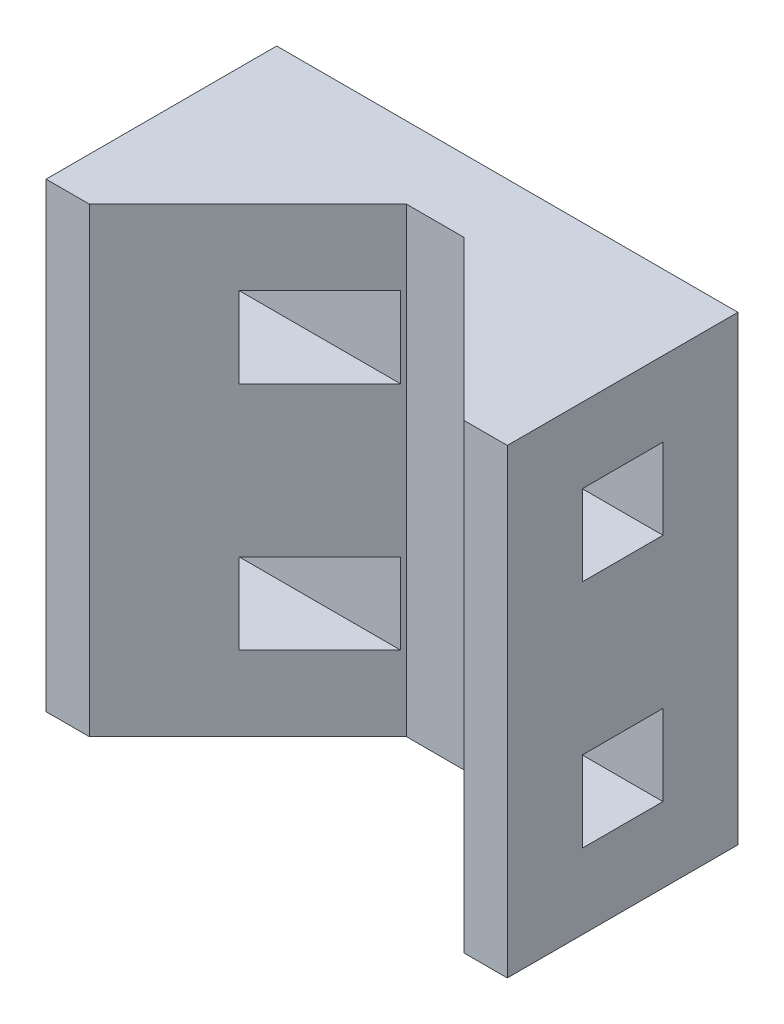
ISO-10303-21;
HEADER;
FILE_DESCRIPTION(('STEP AP214'),'2;1');
FILE_NAME('part.step','',(''),(''),'','','');
FILE_SCHEMA(('AUTOMOTIVE_DESIGN { 1 0 10303 214 1 1 1 1 }'));
ENDSEC;
DATA;
#1=APPLICATION_CONTEXT('core data for automotive mechanical design processes');
#2=APPLICATION_PROTOCOL_DEFINITION('international standard','automotive_design',2000,#1);
#3=PRODUCT_CONTEXT('',#1,'mechanical');
#4=PRODUCT('Part','Part','',(#3));
#5=PRODUCT_RELATED_PRODUCT_CATEGORY('part','',(#4));
#6=PRODUCT_DEFINITION_FORMATION('','',#4);
#7=PRODUCT_DEFINITION_CONTEXT('part definition',#1,'design');
#8=PRODUCT_DEFINITION('design','',#6,#7);
#9=PRODUCT_DEFINITION_SHAPE('','',#8);
#10=(LENGTH_UNIT() NAMED_UNIT(*) SI_UNIT(.MILLI.,.METRE.));
#11=(NAMED_UNIT(*) PLANE_ANGLE_UNIT() SI_UNIT($,.RADIAN.));
#12=(NAMED_UNIT(*) SI_UNIT($,.STERADIAN.) SOLID_ANGLE_UNIT());
#13=UNCERTAINTY_MEASURE_WITH_UNIT(LENGTH_MEASURE(1.E-05),#10,'distance_accuracy_value','');
#14=(GEOMETRIC_REPRESENTATION_CONTEXT(3) GLOBAL_UNCERTAINTY_ASSIGNED_CONTEXT((#13)) GLOBAL_UNIT_ASSIGNED_CONTEXT((#10,
#11,#12)) REPRESENTATION_CONTEXT('',''));
#15=CARTESIAN_POINT('',(0.,0.,0.));
#16=DIRECTION('',(0.,0.,1.));
#17=DIRECTION('',(1.,0.,0.));
#18=AXIS2_PLACEMENT_3D('',#15,#16,#17);
#19=CARTESIAN_POINT('',(18.0000000000001,-4.,6.49999999999997));
#20=DIRECTION('',(0.,0.,-1.));
#21=DIRECTION('',(0.,1.,0.));
#22=AXIS2_PLACEMENT_3D('',#19,#20,#21);
#23=PLANE('',#22);
#24=DIRECTION('',(-1.,0.,0.));
#25=VECTOR('',#24,1.);
#26=CARTESIAN_POINT('',(18.0000000000001,-4.,6.49999999999997));
#27=LINE('',#26,#25);
#28=CARTESIAN_POINT('',(-15.9999999999999,-4.,6.49999999999997));
#29=VERTEX_POINT('',#28);
#30=CARTESIAN_POINT('',(-18.0000000000001,-4.,6.49999999999997));
#31=VERTEX_POINT('',#30);
#32=EDGE_CURVE('E369',#29,#31,#27,.T.);
#33=ORIENTED_EDGE('',*,*,#32,.F.);
#34=DIRECTION('',(0.,1.,0.));
#35=VECTOR('',#34,1.);
#36=CARTESIAN_POINT('',(-15.9999999999999,-4.,6.49999999999997));
#37=LINE('',#36,#35);
#38=CARTESIAN_POINT('',(-15.9999999999999,12.,6.50000000000002));
#39=VERTEX_POINT('',#38);
#40=EDGE_CURVE('E299',#29,#39,#37,.T.);
#41=ORIENTED_EDGE('',*,*,#40,.T.);
#42=DIRECTION('',(-1.,0.,0.));
#43=VECTOR('',#42,1.);
#44=CARTESIAN_POINT('',(18.0000000000001,12.,6.50000000000002));
#45=LINE('',#44,#43);
#46=CARTESIAN_POINT('',(-18.0000000000001,12.,6.50000000000002));
#47=VERTEX_POINT('',#46);
#48=EDGE_CURVE('E368',#39,#47,#45,.T.);
#49=ORIENTED_EDGE('',*,*,#48,.T.);
#50=DIRECTION('',(0.,1.,0.));
#51=VECTOR('',#50,1.);
#52=CARTESIAN_POINT('',(-18.0000000000001,-4.,6.49999999999997));
#53=LINE('',#52,#51);
#54=EDGE_CURVE('E11',#31,#47,#53,.T.);
#55=ORIENTED_EDGE('',*,*,#54,.F.);
#56=EDGE_LOOP('',(#33,#41,#49,#55));
#57=FACE_BOUND('',#56,.T.);
#58=ADVANCED_FACE('F36',(#57),#23,.F.);
#59=CARTESIAN_POINT('',(-23.5,-4.00000000000001,12.));
#60=DIRECTION('',(-0.707106781186552,0.,-0.707106781186544));
#61=DIRECTION('',(0.707106781186544,0.,-0.707106781186551));
#62=AXIS2_PLACEMENT_3D('',#59,#60,#61);
#63=PLANE('',#62);
#64=DIRECTION('',(0.,1.,0.));
#65=VECTOR('',#64,1.);
#66=CARTESIAN_POINT('',(-20.9,-4.,9.39999999999997));
#67=LINE('',#66,#65);
#68=CARTESIAN_POINT('',(-20.9,6.59999999999999,9.40000000000001));
#69=VERTEX_POINT('',#68);
#70=CARTESIAN_POINT('',(-20.9,9.4,9.40000000000002));
#71=VERTEX_POINT('',#70);
#72=EDGE_CURVE('E315',#69,#71,#67,.T.);
#73=ORIENTED_EDGE('',*,*,#72,.T.);
#74=DIRECTION('',(0.707106781186544,0.,-0.707106781186551));
#75=VECTOR('',#74,1.);
#76=CARTESIAN_POINT('',(-23.5,9.39999999999999,12.));
#77=LINE('',#76,#75);
#78=CARTESIAN_POINT('',(-18.1000000000001,9.40000000000001,6.60000000000002));
#79=VERTEX_POINT('',#78);
#80=EDGE_CURVE('E330',#71,#79,#77,.T.);
#81=ORIENTED_EDGE('',*,*,#80,.T.);
#82=DIRECTION('',(0.,-1.,0.));
#83=VECTOR('',#82,1.);
#84=CARTESIAN_POINT('',(-18.1000000000001,-4.,6.59999999999997));
#85=LINE('',#84,#83);
#86=CARTESIAN_POINT('',(-18.1000000000001,6.60000000000001,6.60000000000001));
#87=VERTEX_POINT('',#86);
#88=EDGE_CURVE('E327',#79,#87,#85,.T.);
#89=ORIENTED_EDGE('',*,*,#88,.T.);
#90=DIRECTION('',(-0.707106781186544,0.,0.707106781186551));
#91=VECTOR('',#90,1.);
#92=CARTESIAN_POINT('',(-23.5,6.59999999999998,12.));
#93=LINE('',#92,#91);
#94=EDGE_CURVE('E324',#87,#69,#93,.T.);
#95=ORIENTED_EDGE('',*,*,#94,.T.);
#96=EDGE_LOOP('',(#73,#81,#89,#95));
#97=FACE_BOUND('',#96,.T.);
#98=DIRECTION('',(0.,1.,0.));
#99=VECTOR('',#98,1.);
#100=CARTESIAN_POINT('',(-20.9,-4.,9.39999999999997));
#101=LINE('',#100,#99);
#102=CARTESIAN_POINT('',(-20.9,-1.40000000000001,9.39999999999998));
#103=VERTEX_POINT('',#102);
#104=CARTESIAN_POINT('',(-20.9,1.4,9.39999999999999));
#105=VERTEX_POINT('',#104);
#106=EDGE_CURVE('E349',#103,#105,#101,.T.);
#107=ORIENTED_EDGE('',*,*,#106,.T.);
#108=DIRECTION('',(0.707106781186544,0.,-0.707106781186551));
#109=VECTOR('',#108,1.);
#110=CARTESIAN_POINT('',(-23.5,1.39999999999999,12.));
#111=LINE('',#110,#109);
#112=CARTESIAN_POINT('',(-18.1000000000001,1.40000000000001,6.59999999999999));
#113=VERTEX_POINT('',#112);
#114=EDGE_CURVE('E365',#105,#113,#111,.T.);
#115=ORIENTED_EDGE('',*,*,#114,.T.);
#116=DIRECTION('',(0.,-1.,0.));
#117=VECTOR('',#116,1.);
#118=CARTESIAN_POINT('',(-18.1000000000001,-4.,6.59999999999997));
#119=LINE('',#118,#117);
#120=CARTESIAN_POINT('',(-18.1000000000001,-1.39999999999999,6.59999999999998));
#121=VERTEX_POINT('',#120);
#122=EDGE_CURVE('E362',#113,#121,#119,.T.);
#123=ORIENTED_EDGE('',*,*,#122,.T.);
#124=DIRECTION('',(-0.707106781186544,0.,0.707106781186551));
#125=VECTOR('',#124,1.);
#126=CARTESIAN_POINT('',(-23.5,-1.40000000000002,12.));
#127=LINE('',#126,#125);
#128=EDGE_CURVE('E359',#121,#103,#127,.T.);
#129=ORIENTED_EDGE('',*,*,#128,.T.);
#130=EDGE_LOOP('',(#107,#115,#123,#129));
#131=FACE_BOUND('',#130,.T.);
#132=DIRECTION('',(-0.707106781186544,0.,0.707106781186551));
#133=VECTOR('',#132,1.);
#134=CARTESIAN_POINT('',(-23.5,12.,12.));
#135=LINE('',#134,#133);
#136=CARTESIAN_POINT('',(-23.5,12.,12.));
#137=VERTEX_POINT('',#136);
#138=EDGE_CURVE('E382',#47,#137,#135,.T.);
#139=ORIENTED_EDGE('',*,*,#138,.T.);
#140=DIRECTION('',(0.,1.,0.));
#141=VECTOR('',#140,1.);
#142=CARTESIAN_POINT('',(-23.5,-4.00000000000001,12.));
#143=LINE('',#142,#141);
#144=CARTESIAN_POINT('',(-23.5,-4.00000000000001,12.));
#145=VERTEX_POINT('',#144);
#146=EDGE_CURVE('E43',#145,#137,#143,.T.);
#147=ORIENTED_EDGE('',*,*,#146,.F.);
#148=DIRECTION('',(-0.707106781186544,0.,0.707106781186551));
#149=VECTOR('',#148,1.);
#150=CARTESIAN_POINT('',(-23.5,-4.00000000000001,12.));
#151=LINE('',#150,#149);
#152=EDGE_CURVE('E371',#31,#145,#151,.T.);
#153=ORIENTED_EDGE('',*,*,#152,.F.);
#154=ORIENTED_EDGE('',*,*,#54,.T.);
#155=EDGE_LOOP('',(#139,#147,#153,#154));
#156=FACE_BOUND('',#155,.T.);
#157=ADVANCED_FACE('F420',(#97,#131,#156),#63,.F.);
#158=CARTESIAN_POINT('',(-25.,-4.00000000000001,12.));
#159=DIRECTION('',(0.,0.,-1.));
#160=DIRECTION('',(0.,1.,0.));
#161=AXIS2_PLACEMENT_3D('',#158,#159,#160);
#162=PLANE('',#161);
#163=DIRECTION('',(-1.,0.,0.));
#164=VECTOR('',#163,1.);
#165=CARTESIAN_POINT('',(-25.,12.,12.));
#166=LINE('',#165,#164);
#167=CARTESIAN_POINT('',(-25.,12.,12.));
#168=VERTEX_POINT('',#167);
#169=EDGE_CURVE('E384',#137,#168,#166,.T.);
#170=ORIENTED_EDGE('',*,*,#169,.T.);
#171=DIRECTION('',(0.,1.,0.));
#172=VECTOR('',#171,1.);
#173=CARTESIAN_POINT('',(-25.,-4.00000000000001,12.));
#174=LINE('',#173,#172);
#175=CARTESIAN_POINT('',(-25.,-4.00000000000001,12.));
#176=VERTEX_POINT('',#175);
#177=EDGE_CURVE('E391',#176,#168,#174,.T.);
#178=ORIENTED_EDGE('',*,*,#177,.F.);
#179=DIRECTION('',(-1.,0.,0.));
#180=VECTOR('',#179,1.);
#181=CARTESIAN_POINT('',(-25.,-4.00000000000001,12.));
#182=LINE('',#181,#180);
#183=EDGE_CURVE('E374',#145,#176,#182,.T.);
#184=ORIENTED_EDGE('',*,*,#183,.F.);
#185=ORIENTED_EDGE('',*,*,#146,.T.);
#186=EDGE_LOOP('',(#170,#178,#184,#185));
#187=FACE_BOUND('',#186,.T.);
#188=ADVANCED_FACE('F398',(#187),#162,.F.);
#189=CARTESIAN_POINT('',(-25.,-3.99999999999999,3.99999999999997));
#190=DIRECTION('',(1.,0.,0.));
#191=DIRECTION('',(0.,1.,0.));
#192=AXIS2_PLACEMENT_3D('',#189,#190,#191);
#193=PLANE('',#192);
#194=DIRECTION('',(0.,1.,0.));
#195=VECTOR('',#194,1.);
#196=CARTESIAN_POINT('',(-25.,6.60000000000001,6.60000000000001));
#197=LINE('',#196,#195);
#198=CARTESIAN_POINT('',(-25.,6.60000000000001,6.60000000000001));
#199=VERTEX_POINT('',#198);
#200=CARTESIAN_POINT('',(-25.,9.40000000000001,6.60000000000002));
#201=VERTEX_POINT('',#200);
#202=EDGE_CURVE('E309',#199,#201,#197,.T.);
#203=ORIENTED_EDGE('',*,*,#202,.T.);
#204=DIRECTION('',(0.,0.,1.));
#205=VECTOR('',#204,1.);
#206=CARTESIAN_POINT('',(-25.,9.4,9.40000000000002));
#207=LINE('',#206,#205);
#208=CARTESIAN_POINT('',(-25.,9.4,9.40000000000002));
#209=VERTEX_POINT('',#208);
#210=EDGE_CURVE('E302',#201,#209,#207,.T.);
#211=ORIENTED_EDGE('',*,*,#210,.T.);
#212=DIRECTION('',(0.,-1.,0.));
#213=VECTOR('',#212,1.);
#214=CARTESIAN_POINT('',(-25.,6.59999999999999,9.40000000000001));
#215=LINE('',#214,#213);
#216=CARTESIAN_POINT('',(-25.,6.59999999999999,9.40000000000001));
#217=VERTEX_POINT('',#216);
#218=EDGE_CURVE('E305',#209,#217,#215,.T.);
#219=ORIENTED_EDGE('',*,*,#218,.T.);
#220=DIRECTION('',(0.,0.,-1.));
#221=VECTOR('',#220,1.);
#222=CARTESIAN_POINT('',(-25.,6.59999999999999,9.40000000000001));
#223=LINE('',#222,#221);
#224=EDGE_CURVE('E58',#217,#199,#223,.T.);
#225=ORIENTED_EDGE('',*,*,#224,.T.);
#226=EDGE_LOOP('',(#203,#211,#219,#225));
#227=FACE_BOUND('',#226,.T.);
#228=DIRECTION('',(0.,1.,0.));
#229=VECTOR('',#228,1.);
#230=CARTESIAN_POINT('',(-25.,-1.39999999999999,6.59999999999998));
#231=LINE('',#230,#229);
#232=CARTESIAN_POINT('',(-25.,-1.39999999999999,6.59999999999998));
#233=VERTEX_POINT('',#232);
#234=CARTESIAN_POINT('',(-25.,1.40000000000001,6.59999999999999));
#235=VERTEX_POINT('',#234);
#236=EDGE_CURVE('E342',#233,#235,#231,.T.);
#237=ORIENTED_EDGE('',*,*,#236,.T.);
#238=DIRECTION('',(0.,0.,1.));
#239=VECTOR('',#238,1.);
#240=CARTESIAN_POINT('',(-25.,1.4,9.39999999999999));
#241=LINE('',#240,#239);
#242=CARTESIAN_POINT('',(-25.,1.4,9.39999999999999));
#243=VERTEX_POINT('',#242);
#244=EDGE_CURVE('E333',#235,#243,#241,.T.);
#245=ORIENTED_EDGE('',*,*,#244,.T.);
#246=DIRECTION('',(0.,-1.,0.));
#247=VECTOR('',#246,1.);
#248=CARTESIAN_POINT('',(-25.,-1.40000000000001,9.39999999999998));
#249=LINE('',#248,#247);
#250=CARTESIAN_POINT('',(-25.,-1.40000000000001,9.39999999999998));
#251=VERTEX_POINT('',#250);
#252=EDGE_CURVE('E336',#243,#251,#249,.T.);
#253=ORIENTED_EDGE('',*,*,#252,.T.);
#254=DIRECTION('',(0.,0.,-1.));
#255=VECTOR('',#254,1.);
#256=CARTESIAN_POINT('',(-25.,-1.40000000000001,9.39999999999998));
#257=LINE('',#256,#255);
#258=EDGE_CURVE('E339',#251,#233,#257,.T.);
#259=ORIENTED_EDGE('',*,*,#258,.T.);
#260=EDGE_LOOP('',(#237,#245,#253,#259));
#261=FACE_BOUND('',#260,.T.);
#262=DIRECTION('',(0.,0.,-1.));
#263=VECTOR('',#262,1.);
#264=CARTESIAN_POINT('',(-25.,12.,4.00000000000003));
#265=LINE('',#264,#263);
#266=CARTESIAN_POINT('',(-25.,12.,4.00000000000003));
#267=VERTEX_POINT('',#266);
#268=EDGE_CURVE('E386',#168,#267,#265,.T.);
#269=ORIENTED_EDGE('',*,*,#268,.T.);
#270=DIRECTION('',(0.,1.,0.));
#271=VECTOR('',#270,1.);
#272=CARTESIAN_POINT('',(-25.,-3.99999999999999,3.99999999999997));
#273=LINE('',#272,#271);
#274=CARTESIAN_POINT('',(-25.,-3.99999999999999,3.99999999999997));
#275=VERTEX_POINT('',#274);
#276=EDGE_CURVE('E380',#275,#267,#273,.T.);
#277=ORIENTED_EDGE('',*,*,#276,.F.);
#278=DIRECTION('',(0.,0.,-1.));
#279=VECTOR('',#278,1.);
#280=CARTESIAN_POINT('',(-25.,-3.99999999999999,3.99999999999997));
#281=LINE('',#280,#279);
#282=EDGE_CURVE('E376',#176,#275,#281,.T.);
#283=ORIENTED_EDGE('',*,*,#282,.F.);
#284=ORIENTED_EDGE('',*,*,#177,.T.);
#285=EDGE_LOOP('',(#269,#277,#283,#284));
#286=FACE_BOUND('',#285,.T.);
#287=ADVANCED_FACE('F409',(#227,#261,#286),#193,.F.);
#288=CARTESIAN_POINT('',(-25.,-3.99999999999999,3.99999999999997));
#289=DIRECTION('',(0.,0.,1.));
#290=DIRECTION('',(0.,-1.,0.));
#291=AXIS2_PLACEMENT_3D('',#288,#289,#290);
#292=PLANE('',#291);
#293=DIRECTION('',(1.,0.,0.));
#294=VECTOR('',#293,1.);
#295=CARTESIAN_POINT('',(-25.,12.,4.00000000000003));
#296=LINE('',#295,#294);
#297=CARTESIAN_POINT('',(-9.,12.,4.00000000000003));
#298=VERTEX_POINT('',#297);
#299=EDGE_CURVE('E372',#267,#298,#296,.T.);
#300=ORIENTED_EDGE('',*,*,#299,.T.);
#301=DIRECTION('',(0.,1.,0.));
#302=VECTOR('',#301,1.);
#303=CARTESIAN_POINT('',(-9.,-3.99999999999999,3.99999999999997));
#304=LINE('',#303,#302);
#305=CARTESIAN_POINT('',(-9.,-3.99999999999999,3.99999999999997));
#306=VERTEX_POINT('',#305);
#307=EDGE_CURVE('E283',#306,#298,#304,.T.);
#308=ORIENTED_EDGE('',*,*,#307,.F.);
#309=DIRECTION('',(1.,0.,0.));
#310=VECTOR('',#309,1.);
#311=CARTESIAN_POINT('',(-25.,-3.99999999999999,3.99999999999997));
#312=LINE('',#311,#310);
#313=EDGE_CURVE('E378',#275,#306,#312,.T.);
#314=ORIENTED_EDGE('',*,*,#313,.F.);
#315=ORIENTED_EDGE('',*,*,#276,.T.);
#316=EDGE_LOOP('',(#300,#308,#314,#315));
#317=FACE_BOUND('',#316,.T.);
#318=ADVANCED_FACE('F413',(#317),#292,.F.);
#319=CARTESIAN_POINT('',(0.,-3.99999999999999,3.99999999999997));
#320=DIRECTION('',(0.,-1.,0.));
#321=DIRECTION('',(1.,0.,0.));
#322=AXIS2_PLACEMENT_3D('',#319,#320,#321);
#323=PLANE('',#322);
#324=ORIENTED_EDGE('',*,*,#313,.T.);
#325=DIRECTION('',(0.,0.,-1.));
#326=VECTOR('',#325,1.);
#327=CARTESIAN_POINT('',(-9.,-3.99999999999999,3.99999999999997));
#328=LINE('',#327,#326);
#329=CARTESIAN_POINT('',(-9.,-4.00000000000001,12.));
#330=VERTEX_POINT('',#329);
#331=EDGE_CURVE('E280',#330,#306,#328,.T.);
#332=ORIENTED_EDGE('',*,*,#331,.F.);
#333=DIRECTION('',(1.,0.,0.));
#334=VECTOR('',#333,1.);
#335=CARTESIAN_POINT('',(-9.,-4.00000000000001,12.));
#336=LINE('',#335,#334);
#337=CARTESIAN_POINT('',(-10.5,-4.00000000000001,12.));
#338=VERTEX_POINT('',#337);
#339=EDGE_CURVE('E276',#338,#330,#336,.T.);
#340=ORIENTED_EDGE('',*,*,#339,.F.);
#341=DIRECTION('',(0.707106781186544,0.,0.707106781186551));
#342=VECTOR('',#341,1.);
#343=CARTESIAN_POINT('',(-10.5,-4.00000000000001,12.));
#344=LINE('',#343,#342);
#345=EDGE_CURVE('E273',#29,#338,#344,.T.);
#346=ORIENTED_EDGE('',*,*,#345,.F.);
#347=ORIENTED_EDGE('',*,*,#32,.T.);
#348=ORIENTED_EDGE('',*,*,#152,.T.);
#349=ORIENTED_EDGE('',*,*,#183,.T.);
#350=ORIENTED_EDGE('',*,*,#282,.T.);
#351=EDGE_LOOP('',(#324,#332,#340,#346,#347,#348,#349,#350));
#352=FACE_BOUND('',#351,.T.);
#353=ADVANCED_FACE('F416',(#352),#323,.T.);
#354=CARTESIAN_POINT('',(0.,12.,4.00000000000003));
#355=DIRECTION('',(0.,-1.,0.));
#356=DIRECTION('',(1.,0.,0.));
#357=AXIS2_PLACEMENT_3D('',#354,#355,#356);
#358=PLANE('',#357);
#359=ORIENTED_EDGE('',*,*,#48,.F.);
#360=DIRECTION('',(0.707106781186544,0.,0.707106781186551));
#361=VECTOR('',#360,1.);
#362=CARTESIAN_POINT('',(-10.5,12.,12.));
#363=LINE('',#362,#361);
#364=CARTESIAN_POINT('',(-10.5,12.,12.));
#365=VERTEX_POINT('',#364);
#366=EDGE_CURVE('E272',#39,#365,#363,.T.);
#367=ORIENTED_EDGE('',*,*,#366,.T.);
#368=DIRECTION('',(1.,0.,0.));
#369=VECTOR('',#368,1.);
#370=CARTESIAN_POINT('',(-9.,12.,12.));
#371=LINE('',#370,#369);
#372=CARTESIAN_POINT('',(-9.,12.,12.));
#373=VERTEX_POINT('',#372);
#374=EDGE_CURVE('E286',#365,#373,#371,.T.);
#375=ORIENTED_EDGE('',*,*,#374,.T.);
#376=DIRECTION('',(0.,0.,-1.));
#377=VECTOR('',#376,1.);
#378=CARTESIAN_POINT('',(-9.,12.,4.00000000000003));
#379=LINE('',#378,#377);
#380=EDGE_CURVE('E277',#373,#298,#379,.T.);
#381=ORIENTED_EDGE('',*,*,#380,.T.);
#382=ORIENTED_EDGE('',*,*,#299,.F.);
#383=ORIENTED_EDGE('',*,*,#268,.F.);
#384=ORIENTED_EDGE('',*,*,#169,.F.);
#385=ORIENTED_EDGE('',*,*,#138,.F.);
#386=EDGE_LOOP('',(#359,#367,#375,#381,#382,#383,#384,#385));
#387=FACE_BOUND('',#386,.T.);
#388=ADVANCED_FACE('F405',(#387),#358,.F.);
#389=CARTESIAN_POINT('',(-25.,-1.40000000000001,9.39999999999998));
#390=DIRECTION('',(0.,0.,1.));
#391=DIRECTION('',(0.,-1.,0.));
#392=AXIS2_PLACEMENT_3D('',#389,#390,#391);
#393=PLANE('',#392);
#394=DIRECTION('',(1.,0.,0.));
#395=VECTOR('',#394,1.);
#396=CARTESIAN_POINT('',(-25.,-1.40000000000001,9.39999999999998));
#397=LINE('',#396,#395);
#398=EDGE_CURVE('E353',#251,#103,#397,.T.);
#399=ORIENTED_EDGE('',*,*,#398,.F.);
#400=ORIENTED_EDGE('',*,*,#252,.F.);
#401=DIRECTION('',(1.,0.,0.));
#402=VECTOR('',#401,1.);
#403=CARTESIAN_POINT('',(-25.,1.4,9.39999999999999));
#404=LINE('',#403,#402);
#405=EDGE_CURVE('E345',#243,#105,#404,.T.);
#406=ORIENTED_EDGE('',*,*,#405,.T.);
#407=ORIENTED_EDGE('',*,*,#106,.F.);
#408=EDGE_LOOP('',(#399,#400,#406,#407));
#409=FACE_BOUND('',#408,.T.);
#410=ADVANCED_FACE('F462',(#409),#393,.F.);
#411=CARTESIAN_POINT('',(-25.,-1.40000000000001,9.39999999999998));
#412=DIRECTION('',(0.,-1.,0.));
#413=DIRECTION('',(0.,0.,-1.));
#414=AXIS2_PLACEMENT_3D('',#411,#412,#413);
#415=PLANE('',#414);
#416=DIRECTION('',(1.,0.,0.));
#417=VECTOR('',#416,1.);
#418=CARTESIAN_POINT('',(-25.,-1.39999999999999,6.59999999999998));
#419=LINE('',#418,#417);
#420=EDGE_CURVE('E350',#233,#121,#419,.T.);
#421=ORIENTED_EDGE('',*,*,#420,.F.);
#422=ORIENTED_EDGE('',*,*,#258,.F.);
#423=ORIENTED_EDGE('',*,*,#398,.T.);
#424=ORIENTED_EDGE('',*,*,#128,.F.);
#425=EDGE_LOOP('',(#421,#422,#423,#424));
#426=FACE_BOUND('',#425,.T.);
#427=ADVANCED_FACE('F472',(#426),#415,.F.);
#428=CARTESIAN_POINT('',(-25.,-1.39999999999999,6.59999999999998));
#429=DIRECTION('',(0.,0.,-1.));
#430=DIRECTION('',(0.,1.,0.));
#431=AXIS2_PLACEMENT_3D('',#428,#429,#430);
#432=PLANE('',#431);
#433=DIRECTION('',(1.,0.,0.));
#434=VECTOR('',#433,1.);
#435=CARTESIAN_POINT('',(-25.,1.40000000000001,6.59999999999999));
#436=LINE('',#435,#434);
#437=EDGE_CURVE('E346',#235,#113,#436,.T.);
#438=ORIENTED_EDGE('',*,*,#437,.F.);
#439=ORIENTED_EDGE('',*,*,#236,.F.);
#440=ORIENTED_EDGE('',*,*,#420,.T.);
#441=ORIENTED_EDGE('',*,*,#122,.F.);
#442=EDGE_LOOP('',(#438,#439,#440,#441));
#443=FACE_BOUND('',#442,.T.);
#444=ADVANCED_FACE('F468',(#443),#432,.F.);
#445=CARTESIAN_POINT('',(-25.,1.4,9.39999999999999));
#446=DIRECTION('',(0.,1.,0.));
#447=DIRECTION('',(-1.,0.,0.));
#448=AXIS2_PLACEMENT_3D('',#445,#446,#447);
#449=PLANE('',#448);
#450=ORIENTED_EDGE('',*,*,#405,.F.);
#451=ORIENTED_EDGE('',*,*,#244,.F.);
#452=ORIENTED_EDGE('',*,*,#437,.T.);
#453=ORIENTED_EDGE('',*,*,#114,.F.);
#454=EDGE_LOOP('',(#450,#451,#452,#453));
#455=FACE_BOUND('',#454,.T.);
#456=ADVANCED_FACE('F465',(#455),#449,.F.);
#457=CARTESIAN_POINT('',(-25.,6.59999999999999,9.40000000000001));
#458=DIRECTION('',(0.,0.,1.));
#459=DIRECTION('',(0.,-1.,0.));
#460=AXIS2_PLACEMENT_3D('',#457,#458,#459);
#461=PLANE('',#460);
#462=DIRECTION('',(1.,0.,0.));
#463=VECTOR('',#462,1.);
#464=CARTESIAN_POINT('',(-25.,6.59999999999999,9.40000000000001));
#465=LINE('',#464,#463);
#466=EDGE_CURVE('E319',#217,#69,#465,.T.);
#467=ORIENTED_EDGE('',*,*,#466,.F.);
#468=ORIENTED_EDGE('',*,*,#218,.F.);
#469=DIRECTION('',(1.,0.,0.));
#470=VECTOR('',#469,1.);
#471=CARTESIAN_POINT('',(-25.,9.4,9.40000000000002));
#472=LINE('',#471,#470);
#473=EDGE_CURVE('E50',#209,#71,#472,.T.);
#474=ORIENTED_EDGE('',*,*,#473,.T.);
#475=ORIENTED_EDGE('',*,*,#72,.F.);
#476=EDGE_LOOP('',(#467,#468,#474,#475));
#477=FACE_BOUND('',#476,.T.);
#478=ADVANCED_FACE('F467',(#477),#461,.F.);
#479=CARTESIAN_POINT('',(-25.,6.59999999999999,9.40000000000001));
#480=DIRECTION('',(0.,-1.,0.));
#481=DIRECTION('',(0.,0.,-1.));
#482=AXIS2_PLACEMENT_3D('',#479,#480,#481);
#483=PLANE('',#482);
#484=DIRECTION('',(1.,0.,0.));
#485=VECTOR('',#484,1.);
#486=CARTESIAN_POINT('',(-25.,6.60000000000001,6.60000000000001));
#487=LINE('',#486,#485);
#488=EDGE_CURVE('E316',#199,#87,#487,.T.);
#489=ORIENTED_EDGE('',*,*,#488,.F.);
#490=ORIENTED_EDGE('',*,*,#224,.F.);
#491=ORIENTED_EDGE('',*,*,#466,.T.);
#492=ORIENTED_EDGE('',*,*,#94,.F.);
#493=EDGE_LOOP('',(#489,#490,#491,#492));
#494=FACE_BOUND('',#493,.T.);
#495=ADVANCED_FACE('F487',(#494),#483,.F.);
#496=CARTESIAN_POINT('',(-25.,6.60000000000001,6.60000000000001));
#497=DIRECTION('',(0.,0.,-1.));
#498=DIRECTION('',(0.,1.,0.));
#499=AXIS2_PLACEMENT_3D('',#496,#497,#498);
#500=PLANE('',#499);
#501=DIRECTION('',(1.,0.,0.));
#502=VECTOR('',#501,1.);
#503=CARTESIAN_POINT('',(-25.,9.40000000000001,6.60000000000002));
#504=LINE('',#503,#502);
#505=EDGE_CURVE('E312',#201,#79,#504,.T.);
#506=ORIENTED_EDGE('',*,*,#505,.F.);
#507=ORIENTED_EDGE('',*,*,#202,.F.);
#508=ORIENTED_EDGE('',*,*,#488,.T.);
#509=ORIENTED_EDGE('',*,*,#88,.F.);
#510=EDGE_LOOP('',(#506,#507,#508,#509));
#511=FACE_BOUND('',#510,.T.);
#512=ADVANCED_FACE('F483',(#511),#500,.F.);
#513=CARTESIAN_POINT('',(-25.,9.4,9.40000000000002));
#514=DIRECTION('',(0.,1.,0.));
#515=DIRECTION('',(-1.,0.,0.));
#516=AXIS2_PLACEMENT_3D('',#513,#514,#515);
#517=PLANE('',#516);
#518=ORIENTED_EDGE('',*,*,#473,.F.);
#519=ORIENTED_EDGE('',*,*,#210,.F.);
#520=ORIENTED_EDGE('',*,*,#505,.T.);
#521=ORIENTED_EDGE('',*,*,#80,.F.);
#522=EDGE_LOOP('',(#518,#519,#520,#521));
#523=FACE_BOUND('',#522,.T.);
#524=ADVANCED_FACE('F480',(#523),#517,.F.);
#525=CARTESIAN_POINT('',(-10.5,-4.00000000000001,12.));
#526=DIRECTION('',(0.707106781186552,0.,-0.707106781186544));
#527=DIRECTION('',(-0.707106781186544,0.,-0.707106781186551));
#528=AXIS2_PLACEMENT_3D('',#525,#526,#527);
#529=PLANE('',#528);
#530=DIRECTION('',(0.,1.,0.));
#531=VECTOR('',#530,1.);
#532=CARTESIAN_POINT('',(-13.1,-4.,9.39999999999997));
#533=LINE('',#532,#531);
#534=CARTESIAN_POINT('',(-13.1,6.59999999999999,9.40000000000001));
#535=VERTEX_POINT('',#534);
#536=CARTESIAN_POINT('',(-13.1,9.4,9.40000000000002));
#537=VERTEX_POINT('',#536);
#538=EDGE_CURVE('E204',#535,#537,#533,.T.);
#539=ORIENTED_EDGE('',*,*,#538,.F.);
#540=DIRECTION('',(0.707106781186544,0.,0.707106781186551));
#541=VECTOR('',#540,1.);
#542=CARTESIAN_POINT('',(-10.5,6.59999999999998,12.));
#543=LINE('',#542,#541);
#544=CARTESIAN_POINT('',(-15.8999999999999,6.60000000000001,6.60000000000001));
#545=VERTEX_POINT('',#544);
#546=EDGE_CURVE('E232',#545,#535,#543,.T.);
#547=ORIENTED_EDGE('',*,*,#546,.F.);
#548=DIRECTION('',(0.,-1.,0.));
#549=VECTOR('',#548,1.);
#550=CARTESIAN_POINT('',(-15.8999999999999,-4.,6.59999999999997));
#551=LINE('',#550,#549);
#552=CARTESIAN_POINT('',(-15.8999999999999,9.40000000000001,6.60000000000002));
#553=VERTEX_POINT('',#552);
#554=EDGE_CURVE('E235',#553,#545,#551,.T.);
#555=ORIENTED_EDGE('',*,*,#554,.F.);
#556=DIRECTION('',(-0.707106781186544,0.,-0.707106781186551));
#557=VECTOR('',#556,1.);
#558=CARTESIAN_POINT('',(-10.5,9.39999999999999,12.));
#559=LINE('',#558,#557);
#560=EDGE_CURVE('E238',#537,#553,#559,.T.);
#561=ORIENTED_EDGE('',*,*,#560,.F.);
#562=EDGE_LOOP('',(#539,#547,#555,#561));
#563=FACE_BOUND('',#562,.T.);
#564=DIRECTION('',(0.,1.,0.));
#565=VECTOR('',#564,1.);
#566=CARTESIAN_POINT('',(-13.1,-4.,9.39999999999997));
#567=LINE('',#566,#565);
#568=CARTESIAN_POINT('',(-13.1,-1.40000000000001,9.39999999999998));
#569=VERTEX_POINT('',#568);
#570=CARTESIAN_POINT('',(-13.1,1.4,9.39999999999999));
#571=VERTEX_POINT('',#570);
#572=EDGE_CURVE('E255',#569,#571,#567,.T.);
#573=ORIENTED_EDGE('',*,*,#572,.F.);
#574=DIRECTION('',(0.707106781186544,0.,0.707106781186551));
#575=VECTOR('',#574,1.);
#576=CARTESIAN_POINT('',(-10.5,-1.40000000000002,12.));
#577=LINE('',#576,#575);
#578=CARTESIAN_POINT('',(-15.8999999999999,-1.39999999999999,6.59999999999998));
#579=VERTEX_POINT('',#578);
#580=EDGE_CURVE('E263',#579,#569,#577,.T.);
#581=ORIENTED_EDGE('',*,*,#580,.F.);
#582=DIRECTION('',(0.,-1.,0.));
#583=VECTOR('',#582,1.);
#584=CARTESIAN_POINT('',(-15.8999999999999,-4.,6.59999999999997));
#585=LINE('',#584,#583);
#586=CARTESIAN_POINT('',(-15.8999999999999,1.40000000000001,6.59999999999999));
#587=VERTEX_POINT('',#586);
#588=EDGE_CURVE('E266',#587,#579,#585,.T.);
#589=ORIENTED_EDGE('',*,*,#588,.F.);
#590=DIRECTION('',(-0.707106781186544,0.,-0.707106781186551));
#591=VECTOR('',#590,1.);
#592=CARTESIAN_POINT('',(-10.5,1.39999999999999,12.));
#593=LINE('',#592,#591);
#594=EDGE_CURVE('E269',#571,#587,#593,.T.);
#595=ORIENTED_EDGE('',*,*,#594,.F.);
#596=EDGE_LOOP('',(#573,#581,#589,#595));
#597=FACE_BOUND('',#596,.T.);
#598=ORIENTED_EDGE('',*,*,#366,.F.);
#599=ORIENTED_EDGE('',*,*,#40,.F.);
#600=ORIENTED_EDGE('',*,*,#345,.T.);
#601=DIRECTION('',(0.,1.,0.));
#602=VECTOR('',#601,1.);
#603=CARTESIAN_POINT('',(-10.5,-4.00000000000001,12.));
#604=LINE('',#603,#602);
#605=EDGE_CURVE('E296',#338,#365,#604,.T.);
#606=ORIENTED_EDGE('',*,*,#605,.T.);
#607=EDGE_LOOP('',(#598,#599,#600,#606));
#608=FACE_BOUND('',#607,.T.);
#609=ADVANCED_FACE('F425',(#563,#597,#608),#529,.F.);
#610=CARTESIAN_POINT('',(-9.,-4.00000000000001,12.));
#611=DIRECTION('',(0.,0.,-1.));
#612=DIRECTION('',(0.,1.,0.));
#613=AXIS2_PLACEMENT_3D('',#610,#611,#612);
#614=PLANE('',#613);
#615=ORIENTED_EDGE('',*,*,#374,.F.);
#616=ORIENTED_EDGE('',*,*,#605,.F.);
#617=ORIENTED_EDGE('',*,*,#339,.T.);
#618=DIRECTION('',(0.,1.,0.));
#619=VECTOR('',#618,1.);
#620=CARTESIAN_POINT('',(-9.,-4.00000000000001,12.));
#621=LINE('',#620,#619);
#622=EDGE_CURVE('E293',#330,#373,#621,.T.);
#623=ORIENTED_EDGE('',*,*,#622,.T.);
#624=EDGE_LOOP('',(#615,#616,#617,#623));
#625=FACE_BOUND('',#624,.T.);
#626=ADVANCED_FACE('F428',(#625),#614,.F.);
#627=CARTESIAN_POINT('',(-9.,-3.99999999999999,3.99999999999997));
#628=DIRECTION('',(-1.,0.,0.));
#629=DIRECTION('',(0.,1.,0.));
#630=AXIS2_PLACEMENT_3D('',#627,#628,#629);
#631=PLANE('',#630);
#632=DIRECTION('',(0.,1.,0.));
#633=VECTOR('',#632,1.);
#634=CARTESIAN_POINT('',(-9.,6.60000000000001,6.60000000000001));
#635=LINE('',#634,#633);
#636=CARTESIAN_POINT('',(-9.,6.60000000000001,6.60000000000001));
#637=VERTEX_POINT('',#636);
#638=CARTESIAN_POINT('',(-9.,9.40000000000001,6.60000000000002));
#639=VERTEX_POINT('',#638);
#640=EDGE_CURVE('E209',#637,#639,#635,.T.);
#641=ORIENTED_EDGE('',*,*,#640,.F.);
#642=DIRECTION('',(0.,0.,-1.));
#643=VECTOR('',#642,1.);
#644=CARTESIAN_POINT('',(-9.,6.59999999999999,9.40000000000001));
#645=LINE('',#644,#643);
#646=CARTESIAN_POINT('',(-9.,6.59999999999999,9.40000000000001));
#647=VERTEX_POINT('',#646);
#648=EDGE_CURVE('E222',#647,#637,#645,.T.);
#649=ORIENTED_EDGE('',*,*,#648,.F.);
#650=DIRECTION('',(0.,-1.,0.));
#651=VECTOR('',#650,1.);
#652=CARTESIAN_POINT('',(-9.,6.59999999999999,9.40000000000001));
#653=LINE('',#652,#651);
#654=CARTESIAN_POINT('',(-9.,9.4,9.40000000000002));
#655=VERTEX_POINT('',#654);
#656=EDGE_CURVE('E201',#655,#647,#653,.T.);
#657=ORIENTED_EDGE('',*,*,#656,.F.);
#658=DIRECTION('',(0.,0.,1.));
#659=VECTOR('',#658,1.);
#660=CARTESIAN_POINT('',(-9.,9.4,9.40000000000002));
#661=LINE('',#660,#659);
#662=EDGE_CURVE('E212',#639,#655,#661,.T.);
#663=ORIENTED_EDGE('',*,*,#662,.F.);
#664=EDGE_LOOP('',(#641,#649,#657,#663));
#665=FACE_BOUND('',#664,.T.);
#666=DIRECTION('',(0.,1.,0.));
#667=VECTOR('',#666,1.);
#668=CARTESIAN_POINT('',(-9.,-1.39999999999999,6.59999999999998));
#669=LINE('',#668,#667);
#670=CARTESIAN_POINT('',(-9.,-1.39999999999999,6.59999999999998));
#671=VERTEX_POINT('',#670);
#672=CARTESIAN_POINT('',(-9.,1.40000000000001,6.59999999999999));
#673=VERTEX_POINT('',#672);
#674=EDGE_CURVE('E249',#671,#673,#669,.T.);
#675=ORIENTED_EDGE('',*,*,#674,.F.);
#676=DIRECTION('',(0.,0.,-1.));
#677=VECTOR('',#676,1.);
#678=CARTESIAN_POINT('',(-9.,-1.40000000000001,9.39999999999998));
#679=LINE('',#678,#677);
#680=CARTESIAN_POINT('',(-9.,-1.40000000000001,9.39999999999998));
#681=VERTEX_POINT('',#680);
#682=EDGE_CURVE('E246',#681,#671,#679,.T.);
#683=ORIENTED_EDGE('',*,*,#682,.F.);
#684=DIRECTION('',(0.,-1.,0.));
#685=VECTOR('',#684,1.);
#686=CARTESIAN_POINT('',(-9.,-1.40000000000001,9.39999999999998));
#687=LINE('',#686,#685);
#688=CARTESIAN_POINT('',(-9.,1.4,9.39999999999999));
#689=VERTEX_POINT('',#688);
#690=EDGE_CURVE('E243',#689,#681,#687,.T.);
#691=ORIENTED_EDGE('',*,*,#690,.F.);
#692=DIRECTION('',(0.,0.,1.));
#693=VECTOR('',#692,1.);
#694=CARTESIAN_POINT('',(-9.,1.4,9.39999999999999));
#695=LINE('',#694,#693);
#696=EDGE_CURVE('E240',#673,#689,#695,.T.);
#697=ORIENTED_EDGE('',*,*,#696,.F.);
#698=EDGE_LOOP('',(#675,#683,#691,#697));
#699=FACE_BOUND('',#698,.T.);
#700=ORIENTED_EDGE('',*,*,#380,.F.);
#701=ORIENTED_EDGE('',*,*,#622,.F.);
#702=ORIENTED_EDGE('',*,*,#331,.T.);
#703=ORIENTED_EDGE('',*,*,#307,.T.);
#704=EDGE_LOOP('',(#700,#701,#702,#703));
#705=FACE_BOUND('',#704,.T.);
#706=ADVANCED_FACE('F219',(#665,#699,#705),#631,.F.);
#707=CARTESIAN_POINT('',(-9.,-1.40000000000001,9.39999999999998));
#708=DIRECTION('',(0.,0.,1.));
#709=DIRECTION('',(0.,-1.,0.));
#710=AXIS2_PLACEMENT_3D('',#707,#708,#709);
#711=PLANE('',#710);
#712=DIRECTION('',(-1.,0.,0.));
#713=VECTOR('',#712,1.);
#714=CARTESIAN_POINT('',(-9.,-1.40000000000001,9.39999999999998));
#715=LINE('',#714,#713);
#716=EDGE_CURVE('E258',#681,#569,#715,.T.);
#717=ORIENTED_EDGE('',*,*,#716,.T.);
#718=ORIENTED_EDGE('',*,*,#572,.T.);
#719=DIRECTION('',(-1.,0.,0.));
#720=VECTOR('',#719,1.);
#721=CARTESIAN_POINT('',(-9.,1.4,9.39999999999999));
#722=LINE('',#721,#720);
#723=EDGE_CURVE('E252',#689,#571,#722,.T.);
#724=ORIENTED_EDGE('',*,*,#723,.F.);
#725=ORIENTED_EDGE('',*,*,#690,.T.);
#726=EDGE_LOOP('',(#717,#718,#724,#725));
#727=FACE_BOUND('',#726,.T.);
#728=ADVANCED_FACE('F431',(#727),#711,.F.);
#729=CARTESIAN_POINT('',(-9.,-1.40000000000001,9.39999999999998));
#730=DIRECTION('',(0.,-1.,0.));
#731=DIRECTION('',(0.,0.,-1.));
#732=AXIS2_PLACEMENT_3D('',#729,#730,#731);
#733=PLANE('',#732);
#734=DIRECTION('',(-1.,0.,0.));
#735=VECTOR('',#734,1.);
#736=CARTESIAN_POINT('',(-9.,-1.39999999999999,6.59999999999998));
#737=LINE('',#736,#735);
#738=EDGE_CURVE('E256',#671,#579,#737,.T.);
#739=ORIENTED_EDGE('',*,*,#738,.T.);
#740=ORIENTED_EDGE('',*,*,#580,.T.);
#741=ORIENTED_EDGE('',*,*,#716,.F.);
#742=ORIENTED_EDGE('',*,*,#682,.T.);
#743=EDGE_LOOP('',(#739,#740,#741,#742));
#744=FACE_BOUND('',#743,.T.);
#745=ADVANCED_FACE('F437',(#744),#733,.F.);
#746=CARTESIAN_POINT('',(-9.,-1.39999999999999,6.59999999999998));
#747=DIRECTION('',(0.,0.,-1.));
#748=DIRECTION('',(0.,1.,0.));
#749=AXIS2_PLACEMENT_3D('',#746,#747,#748);
#750=PLANE('',#749);
#751=DIRECTION('',(-1.,0.,0.));
#752=VECTOR('',#751,1.);
#753=CARTESIAN_POINT('',(-9.,1.40000000000001,6.59999999999999));
#754=LINE('',#753,#752);
#755=EDGE_CURVE('E253',#673,#587,#754,.T.);
#756=ORIENTED_EDGE('',*,*,#755,.T.);
#757=ORIENTED_EDGE('',*,*,#588,.T.);
#758=ORIENTED_EDGE('',*,*,#738,.F.);
#759=ORIENTED_EDGE('',*,*,#674,.T.);
#760=EDGE_LOOP('',(#756,#757,#758,#759));
#761=FACE_BOUND('',#760,.T.);
#762=ADVANCED_FACE('F507',(#761),#750,.F.);
#763=CARTESIAN_POINT('',(-9.,1.4,9.39999999999999));
#764=DIRECTION('',(0.,1.,0.));
#765=DIRECTION('',(1.,0.,0.));
#766=AXIS2_PLACEMENT_3D('',#763,#764,#765);
#767=PLANE('',#766);
#768=ORIENTED_EDGE('',*,*,#723,.T.);
#769=ORIENTED_EDGE('',*,*,#594,.T.);
#770=ORIENTED_EDGE('',*,*,#755,.F.);
#771=ORIENTED_EDGE('',*,*,#696,.T.);
#772=EDGE_LOOP('',(#768,#769,#770,#771));
#773=FACE_BOUND('',#772,.T.);
#774=ADVANCED_FACE('F510',(#773),#767,.F.);
#775=CARTESIAN_POINT('',(-9.,6.59999999999999,9.40000000000001));
#776=DIRECTION('',(0.,0.,1.));
#777=DIRECTION('',(0.,-1.,0.));
#778=AXIS2_PLACEMENT_3D('',#775,#776,#777);
#779=PLANE('',#778);
#780=DIRECTION('',(-1.,0.,0.));
#781=VECTOR('',#780,1.);
#782=CARTESIAN_POINT('',(-9.,6.59999999999999,9.40000000000001));
#783=LINE('',#782,#781);
#784=EDGE_CURVE('E208',#647,#535,#783,.T.);
#785=ORIENTED_EDGE('',*,*,#784,.T.);
#786=ORIENTED_EDGE('',*,*,#538,.T.);
#787=DIRECTION('',(-1.,0.,0.));
#788=VECTOR('',#787,1.);
#789=CARTESIAN_POINT('',(-9.,9.4,9.40000000000002));
#790=LINE('',#789,#788);
#791=EDGE_CURVE('E197',#655,#537,#790,.T.);
#792=ORIENTED_EDGE('',*,*,#791,.F.);
#793=ORIENTED_EDGE('',*,*,#656,.T.);
#794=EDGE_LOOP('',(#785,#786,#792,#793));
#795=FACE_BOUND('',#794,.T.);
#796=ADVANCED_FACE('F199',(#795),#779,.F.);
#797=CARTESIAN_POINT('',(-9.,6.59999999999999,9.40000000000001));
#798=DIRECTION('',(0.,-1.,0.));
#799=DIRECTION('',(0.,0.,-1.));
#800=AXIS2_PLACEMENT_3D('',#797,#798,#799);
#801=PLANE('',#800);
#802=DIRECTION('',(-1.,0.,0.));
#803=VECTOR('',#802,1.);
#804=CARTESIAN_POINT('',(-9.,6.60000000000001,6.60000000000001));
#805=LINE('',#804,#803);
#806=EDGE_CURVE('E228',#637,#545,#805,.T.);
#807=ORIENTED_EDGE('',*,*,#806,.T.);
#808=ORIENTED_EDGE('',*,*,#546,.T.);
#809=ORIENTED_EDGE('',*,*,#784,.F.);
#810=ORIENTED_EDGE('',*,*,#648,.T.);
#811=EDGE_LOOP('',(#807,#808,#809,#810));
#812=FACE_BOUND('',#811,.T.);
#813=ADVANCED_FACE('F516',(#812),#801,.F.);
#814=CARTESIAN_POINT('',(-9.,6.60000000000001,6.60000000000001));
#815=DIRECTION('',(0.,0.,-1.));
#816=DIRECTION('',(0.,1.,0.));
#817=AXIS2_PLACEMENT_3D('',#814,#815,#816);
#818=PLANE('',#817);
#819=DIRECTION('',(-1.,0.,0.));
#820=VECTOR('',#819,1.);
#821=CARTESIAN_POINT('',(-9.,9.40000000000001,6.60000000000002));
#822=LINE('',#821,#820);
#823=EDGE_CURVE('E214',#639,#553,#822,.T.);
#824=ORIENTED_EDGE('',*,*,#823,.T.);
#825=ORIENTED_EDGE('',*,*,#554,.T.);
#826=ORIENTED_EDGE('',*,*,#806,.F.);
#827=ORIENTED_EDGE('',*,*,#640,.T.);
#828=EDGE_LOOP('',(#824,#825,#826,#827));
#829=FACE_BOUND('',#828,.T.);
#830=ADVANCED_FACE('F523',(#829),#818,.F.);
#831=CARTESIAN_POINT('',(-9.,9.4,9.40000000000002));
#832=DIRECTION('',(0.,1.,0.));
#833=DIRECTION('',(1.,0.,0.));
#834=AXIS2_PLACEMENT_3D('',#831,#832,#833);
#835=PLANE('',#834);
#836=ORIENTED_EDGE('',*,*,#791,.T.);
#837=ORIENTED_EDGE('',*,*,#560,.T.);
#838=ORIENTED_EDGE('',*,*,#823,.F.);
#839=ORIENTED_EDGE('',*,*,#662,.T.);
#840=EDGE_LOOP('',(#836,#837,#838,#839));
#841=FACE_BOUND('',#840,.T.);
#842=ADVANCED_FACE('F213',(#841),#835,.F.);
#843=CLOSED_SHELL('',(#58,#157,#188,#287,#318,#353,#388,#410,#427,#444,#456,#478,#495,#512,#524,
#609,#626,#706,#728,#745,#762,#774,#796,#813,#830,#842));
#844=MANIFOLD_SOLID_BREP('B2',#843);
#845=ADVANCED_BREP_SHAPE_REPRESENTATION('',(#18,#844),#14);
#846=SHAPE_DEFINITION_REPRESENTATION(#9,#845);
ENDSEC;
END-ISO-10303-21;
